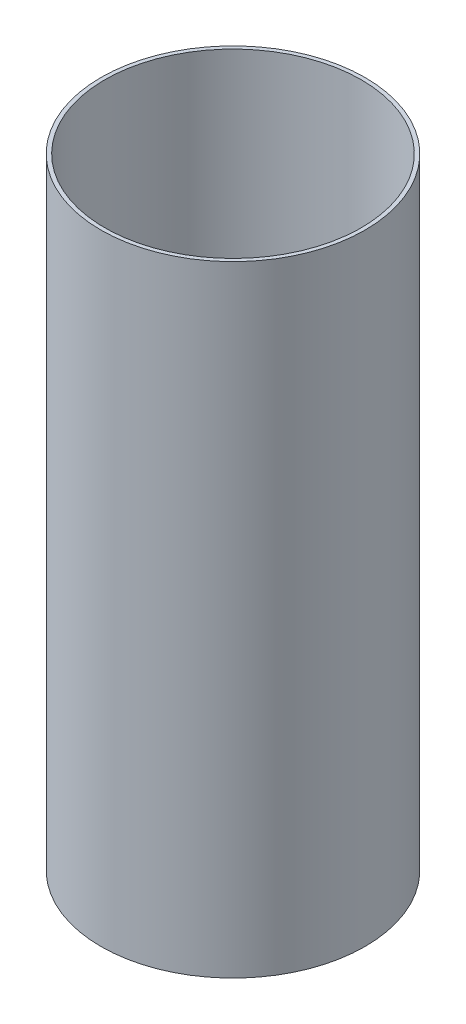
ISO-10303-21;
HEADER;
FILE_DESCRIPTION(('STEP AP214'),'2;1');
FILE_NAME('part.step','',(''),(''),'','','');
FILE_SCHEMA(('AUTOMOTIVE_DESIGN { 1 0 10303 214 1 1 1 1 }'));
ENDSEC;
DATA;
#1=APPLICATION_CONTEXT('core data for automotive mechanical design processes');
#2=APPLICATION_PROTOCOL_DEFINITION('international standard','automotive_design',2000,#1);
#3=PRODUCT_CONTEXT('',#1,'mechanical');
#4=PRODUCT('Part','Part','',(#3));
#5=PRODUCT_RELATED_PRODUCT_CATEGORY('part','',(#4));
#6=PRODUCT_DEFINITION_FORMATION('','',#4);
#7=PRODUCT_DEFINITION_CONTEXT('part definition',#1,'design');
#8=PRODUCT_DEFINITION('design','',#6,#7);
#9=PRODUCT_DEFINITION_SHAPE('','',#8);
#10=(LENGTH_UNIT() NAMED_UNIT(*) SI_UNIT(.MILLI.,.METRE.));
#11=(NAMED_UNIT(*) PLANE_ANGLE_UNIT() SI_UNIT($,.RADIAN.));
#12=(NAMED_UNIT(*) SI_UNIT($,.STERADIAN.) SOLID_ANGLE_UNIT());
#13=UNCERTAINTY_MEASURE_WITH_UNIT(LENGTH_MEASURE(1.E-05),#10,'distance_accuracy_value','');
#14=(GEOMETRIC_REPRESENTATION_CONTEXT(3) GLOBAL_UNCERTAINTY_ASSIGNED_CONTEXT((#13)) GLOBAL_UNIT_ASSIGNED_CONTEXT((#10,
#11,#12)) REPRESENTATION_CONTEXT('',''));
#15=CARTESIAN_POINT('',(0.,0.,0.));
#16=DIRECTION('',(0.,0.,1.));
#17=DIRECTION('',(1.,0.,0.));
#18=AXIS2_PLACEMENT_3D('',#15,#16,#17);
#19=CARTESIAN_POINT('',(0.,152.4,0.));
#20=DIRECTION('',(0.,1.,0.));
#21=DIRECTION('',(0.,0.,1.));
#22=AXIS2_PLACEMENT_3D('',#19,#20,#21);
#23=PLANE('',#22);
#24=CARTESIAN_POINT('',(0.,152.4,0.));
#25=DIRECTION('',(0.,1.,0.));
#26=DIRECTION('',(0.,0.,1.));
#27=AXIS2_PLACEMENT_3D('',#24,#25,#26);
#28=CIRCLE('',#27,32.45);
#29=CARTESIAN_POINT('',(0.,152.4,-32.45));
#30=VERTEX_POINT('',#29);
#31=EDGE_CURVE('E10',#30,#30,#28,.T.);
#32=ORIENTED_EDGE('',*,*,#31,.T.);
#33=EDGE_LOOP('',(#32));
#34=FACE_BOUND('',#33,.T.);
#35=CARTESIAN_POINT('',(0.,152.4,0.));
#36=DIRECTION('',(0.,1.,0.));
#37=DIRECTION('',(0.,0.,1.));
#38=AXIS2_PLACEMENT_3D('',#35,#36,#37);
#39=CIRCLE('',#38,31.5);
#40=CARTESIAN_POINT('',(0.,152.4,-31.5));
#41=VERTEX_POINT('',#40);
#42=EDGE_CURVE('E50',#41,#41,#39,.T.);
#43=ORIENTED_EDGE('',*,*,#42,.F.);
#44=EDGE_LOOP('',(#43));
#45=FACE_BOUND('',#44,.T.);
#46=ADVANCED_FACE('F37',(#34,#45),#23,.T.);
#47=CARTESIAN_POINT('',(0.,0.,0.));
#48=DIRECTION('',(0.,1.,0.));
#49=DIRECTION('',(0.,0.,1.));
#50=AXIS2_PLACEMENT_3D('',#47,#48,#49);
#51=PLANE('',#50);
#52=CARTESIAN_POINT('',(0.,0.,0.));
#53=DIRECTION('',(0.,1.,0.));
#54=DIRECTION('',(0.,0.,1.));
#55=AXIS2_PLACEMENT_3D('',#52,#53,#54);
#56=CIRCLE('',#55,32.45);
#57=CARTESIAN_POINT('',(0.,0.,-32.45));
#58=VERTEX_POINT('',#57);
#59=EDGE_CURVE('E41',#58,#58,#56,.T.);
#60=ORIENTED_EDGE('',*,*,#59,.F.);
#61=EDGE_LOOP('',(#60));
#62=FACE_BOUND('',#61,.T.);
#63=CARTESIAN_POINT('',(0.,0.,0.));
#64=DIRECTION('',(0.,1.,0.));
#65=DIRECTION('',(0.,0.,1.));
#66=AXIS2_PLACEMENT_3D('',#63,#64,#65);
#67=CIRCLE('',#66,31.5);
#68=CARTESIAN_POINT('',(0.,0.,-31.5));
#69=VERTEX_POINT('',#68);
#70=EDGE_CURVE('E52',#69,#69,#67,.T.);
#71=ORIENTED_EDGE('',*,*,#70,.T.);
#72=EDGE_LOOP('',(#71));
#73=FACE_BOUND('',#72,.T.);
#74=ADVANCED_FACE('F64',(#62,#73),#51,.F.);
#75=CARTESIAN_POINT('',(0.,152.4,0.));
#76=DIRECTION('',(0.,-1.,0.));
#77=DIRECTION('',(0.,0.,-1.));
#78=AXIS2_PLACEMENT_3D('',#75,#76,#77);
#79=CYLINDRICAL_SURFACE('',#78,32.45);
#80=CARTESIAN_POINT('',(0.,152.4,-32.45));
#81=CARTESIAN_POINT('',(0.,150.8125,-32.45));
#82=CARTESIAN_POINT('',(0.,149.225,-32.45));
#83=CARTESIAN_POINT('',(0.,146.05,-32.45));
#84=CARTESIAN_POINT('',(0.,144.4625,-32.45));
#85=CARTESIAN_POINT('',(0.,141.2875,-32.45));
#86=CARTESIAN_POINT('',(0.,139.7,-32.45));
#87=CARTESIAN_POINT('',(0.,136.525,-32.45));
#88=CARTESIAN_POINT('',(0.,134.9375,-32.45));
#89=CARTESIAN_POINT('',(0.,131.7625,-32.45));
#90=CARTESIAN_POINT('',(0.,130.175,-32.45));
#91=CARTESIAN_POINT('',(0.,127.,-32.45));
#92=CARTESIAN_POINT('',(0.,125.4125,-32.45));
#93=CARTESIAN_POINT('',(0.,122.2375,-32.45));
#94=CARTESIAN_POINT('',(0.,120.65,-32.45));
#95=CARTESIAN_POINT('',(0.,117.475,-32.45));
#96=CARTESIAN_POINT('',(0.,115.8875,-32.45));
#97=CARTESIAN_POINT('',(0.,112.7125,-32.45));
#98=CARTESIAN_POINT('',(0.,111.125,-32.45));
#99=CARTESIAN_POINT('',(0.,107.95,-32.45));
#100=CARTESIAN_POINT('',(0.,106.3625,-32.45));
#101=CARTESIAN_POINT('',(0.,103.1875,-32.45));
#102=CARTESIAN_POINT('',(0.,101.6,-32.45));
#103=CARTESIAN_POINT('',(0.,98.425,-32.45));
#104=CARTESIAN_POINT('',(0.,96.8375,-32.45));
#105=CARTESIAN_POINT('',(0.,93.6625,-32.45));
#106=CARTESIAN_POINT('',(0.,92.075,-32.45));
#107=CARTESIAN_POINT('',(0.,88.9,-32.45));
#108=CARTESIAN_POINT('',(0.,87.3125,-32.45));
#109=CARTESIAN_POINT('',(0.,84.1375,-32.45));
#110=CARTESIAN_POINT('',(0.,82.55,-32.45));
#111=CARTESIAN_POINT('',(0.,79.375,-32.45));
#112=CARTESIAN_POINT('',(0.,77.7875,-32.45));
#113=CARTESIAN_POINT('',(0.,74.6125,-32.45));
#114=CARTESIAN_POINT('',(0.,73.025,-32.45));
#115=CARTESIAN_POINT('',(0.,69.85,-32.45));
#116=CARTESIAN_POINT('',(0.,68.2625,-32.45));
#117=CARTESIAN_POINT('',(0.,65.0875,-32.45));
#118=CARTESIAN_POINT('',(0.,63.5,-32.45));
#119=CARTESIAN_POINT('',(0.,60.325,-32.45));
#120=CARTESIAN_POINT('',(0.,58.7375,-32.45));
#121=CARTESIAN_POINT('',(0.,55.5625,-32.45));
#122=CARTESIAN_POINT('',(0.,53.975,-32.45));
#123=CARTESIAN_POINT('',(0.,50.8,-32.45));
#124=CARTESIAN_POINT('',(0.,49.2125,-32.45));
#125=CARTESIAN_POINT('',(0.,46.0375,-32.45));
#126=CARTESIAN_POINT('',(0.,44.45,-32.45));
#127=CARTESIAN_POINT('',(0.,41.275,-32.45));
#128=CARTESIAN_POINT('',(0.,39.6875,-32.45));
#129=CARTESIAN_POINT('',(0.,36.5125,-32.45));
#130=CARTESIAN_POINT('',(0.,34.925,-32.45));
#131=CARTESIAN_POINT('',(0.,31.75,-32.45));
#132=CARTESIAN_POINT('',(0.,30.1625,-32.45));
#133=CARTESIAN_POINT('',(0.,26.9875,-32.45));
#134=CARTESIAN_POINT('',(0.,25.4,-32.45));
#135=CARTESIAN_POINT('',(0.,22.225,-32.45));
#136=CARTESIAN_POINT('',(0.,20.6375,-32.45));
#137=CARTESIAN_POINT('',(0.,17.4625,-32.45));
#138=CARTESIAN_POINT('',(0.,15.875,-32.45));
#139=CARTESIAN_POINT('',(0.,12.7,-32.45));
#140=CARTESIAN_POINT('',(0.,11.1125,-32.45));
#141=CARTESIAN_POINT('',(0.,7.93750000000001,-32.45));
#142=CARTESIAN_POINT('',(0.,6.35,-32.45));
#143=CARTESIAN_POINT('',(0.,3.175,-32.45));
#144=CARTESIAN_POINT('',(0.,1.5875,-32.45));
#145=CARTESIAN_POINT('',(0.,0.,-32.45));
#146=B_SPLINE_CURVE_WITH_KNOTS('',3,(#80,#81,#82,#83,#84,#85,#86,#87,#88,#89,#90,#91,#92,#93,
#94,#95,#96,#97,#98,#99,#100,#101,#102,#103,#104,#105,#106,#107,#108,#109,#110,#111,#112,#113,
#114,#115,#116,#117,#118,#119,#120,#121,#122,#123,#124,#125,#126,#127,#128,#129,#130,#131,#132,
#133,#134,#135,#136,#137,#138,#139,#140,#141,#142,#143,#144,#145),.UNSPECIFIED.,.F.,.F.,(4,2,2,
2,2,2,2,2,2,2,2,2,2,2,2,2,2,2,2,2,2,2,2,2,2,2,2,2,2,2,2,2,4),(0.,4.7625,9.52500000000001,
14.2875,19.05,23.8125,28.575,33.3375,38.1,42.8625,47.625,52.3875,57.15,61.9125,66.675,71.4375,
76.2,80.9625,85.725,90.4875,95.25,100.0125,104.775,109.5375,114.3,119.0625,123.825,128.5875,
133.35,138.1125,142.875,147.6375,152.4),.UNSPECIFIED.);
#147=EDGE_CURVE('BSEAM39',#30,#58,#146,.T.);
#148=ORIENTED_EDGE('',*,*,#31,.F.);
#149=ORIENTED_EDGE('',*,*,#59,.T.);
#150=ORIENTED_EDGE('',*,*,#147,.T.);
#151=ORIENTED_EDGE('',*,*,#147,.F.);
#152=EDGE_LOOP('',(#148,#150,#149,#151));
#153=FACE_BOUND('',#152,.T.);
#154=ADVANCED_FACE('F39',(#153),#79,.T.);
#155=CARTESIAN_POINT('',(0.,152.4,0.));
#156=DIRECTION('',(0.,-1.,0.));
#157=DIRECTION('',(0.,0.,-1.));
#158=AXIS2_PLACEMENT_3D('',#155,#156,#157);
#159=CYLINDRICAL_SURFACE('',#158,31.5);
#160=CARTESIAN_POINT('',(0.,152.4,-31.5));
#161=CARTESIAN_POINT('',(0.,150.8125,-31.5));
#162=CARTESIAN_POINT('',(0.,149.225,-31.5));
#163=CARTESIAN_POINT('',(0.,146.05,-31.5));
#164=CARTESIAN_POINT('',(0.,144.4625,-31.5));
#165=CARTESIAN_POINT('',(0.,141.2875,-31.5));
#166=CARTESIAN_POINT('',(0.,139.7,-31.5));
#167=CARTESIAN_POINT('',(0.,136.525,-31.5));
#168=CARTESIAN_POINT('',(0.,134.9375,-31.5));
#169=CARTESIAN_POINT('',(0.,131.7625,-31.5));
#170=CARTESIAN_POINT('',(0.,130.175,-31.5));
#171=CARTESIAN_POINT('',(0.,127.,-31.5));
#172=CARTESIAN_POINT('',(0.,125.4125,-31.5));
#173=CARTESIAN_POINT('',(0.,122.2375,-31.5));
#174=CARTESIAN_POINT('',(0.,120.65,-31.5));
#175=CARTESIAN_POINT('',(0.,117.475,-31.5));
#176=CARTESIAN_POINT('',(0.,115.8875,-31.5));
#177=CARTESIAN_POINT('',(0.,112.7125,-31.5));
#178=CARTESIAN_POINT('',(0.,111.125,-31.5));
#179=CARTESIAN_POINT('',(0.,107.95,-31.5));
#180=CARTESIAN_POINT('',(0.,106.3625,-31.5));
#181=CARTESIAN_POINT('',(0.,103.1875,-31.5));
#182=CARTESIAN_POINT('',(0.,101.6,-31.5));
#183=CARTESIAN_POINT('',(0.,98.425,-31.5));
#184=CARTESIAN_POINT('',(0.,96.8375,-31.5));
#185=CARTESIAN_POINT('',(0.,93.6625,-31.5));
#186=CARTESIAN_POINT('',(0.,92.075,-31.5));
#187=CARTESIAN_POINT('',(0.,88.9,-31.5));
#188=CARTESIAN_POINT('',(0.,87.3125,-31.5));
#189=CARTESIAN_POINT('',(0.,84.1375,-31.5));
#190=CARTESIAN_POINT('',(0.,82.55,-31.5));
#191=CARTESIAN_POINT('',(0.,79.375,-31.5));
#192=CARTESIAN_POINT('',(0.,77.7875,-31.5));
#193=CARTESIAN_POINT('',(0.,74.6125,-31.5));
#194=CARTESIAN_POINT('',(0.,73.025,-31.5));
#195=CARTESIAN_POINT('',(0.,69.85,-31.5));
#196=CARTESIAN_POINT('',(0.,68.2625,-31.5));
#197=CARTESIAN_POINT('',(0.,65.0875,-31.5));
#198=CARTESIAN_POINT('',(0.,63.5,-31.5));
#199=CARTESIAN_POINT('',(0.,60.325,-31.5));
#200=CARTESIAN_POINT('',(0.,58.7375,-31.5));
#201=CARTESIAN_POINT('',(0.,55.5625,-31.5));
#202=CARTESIAN_POINT('',(0.,53.975,-31.5));
#203=CARTESIAN_POINT('',(0.,50.8,-31.5));
#204=CARTESIAN_POINT('',(0.,49.2125,-31.5));
#205=CARTESIAN_POINT('',(0.,46.0375,-31.5));
#206=CARTESIAN_POINT('',(0.,44.45,-31.5));
#207=CARTESIAN_POINT('',(0.,41.275,-31.5));
#208=CARTESIAN_POINT('',(0.,39.6875,-31.5));
#209=CARTESIAN_POINT('',(0.,36.5125,-31.5));
#210=CARTESIAN_POINT('',(0.,34.925,-31.5));
#211=CARTESIAN_POINT('',(0.,31.75,-31.5));
#212=CARTESIAN_POINT('',(0.,30.1625,-31.5));
#213=CARTESIAN_POINT('',(0.,26.9875,-31.5));
#214=CARTESIAN_POINT('',(0.,25.4,-31.5));
#215=CARTESIAN_POINT('',(0.,22.225,-31.5));
#216=CARTESIAN_POINT('',(0.,20.6375,-31.5));
#217=CARTESIAN_POINT('',(0.,17.4625,-31.5));
#218=CARTESIAN_POINT('',(0.,15.875,-31.5));
#219=CARTESIAN_POINT('',(0.,12.7,-31.5));
#220=CARTESIAN_POINT('',(0.,11.1125,-31.5));
#221=CARTESIAN_POINT('',(0.,7.93750000000001,-31.5));
#222=CARTESIAN_POINT('',(0.,6.35,-31.5));
#223=CARTESIAN_POINT('',(0.,3.175,-31.5));
#224=CARTESIAN_POINT('',(0.,1.5875,-31.5));
#225=CARTESIAN_POINT('',(0.,0.,-31.5));
#226=B_SPLINE_CURVE_WITH_KNOTS('',3,(#160,#161,#162,#163,#164,#165,#166,#167,#168,#169,#170,
#171,#172,#173,#174,#175,#176,#177,#178,#179,#180,#181,#182,#183,#184,#185,#186,#187,#188,#189,
#190,#191,#192,#193,#194,#195,#196,#197,#198,#199,#200,#201,#202,#203,#204,#205,#206,#207,#208,
#209,#210,#211,#212,#213,#214,#215,#216,#217,#218,#219,#220,#221,#222,#223,#224,#225),
.UNSPECIFIED.,.F.,.F.,(4,2,2,2,2,2,2,2,2,2,2,2,2,2,2,2,2,2,2,2,2,2,2,2,2,2,2,2,2,2,2,2,4),(0.,
4.7625,9.52500000000001,14.2875,19.05,23.8125,28.575,33.3375,38.1,42.8625,47.625,52.3875,57.15,
61.9125,66.675,71.4375,76.2,80.9625,85.725,90.4875,95.25,100.0125,104.775,109.5375,114.3,
119.0625,123.825,128.5875,133.35,138.1125,142.875,147.6375,152.4),.UNSPECIFIED.);
#227=EDGE_CURVE('BSEAM60',#41,#69,#226,.T.);
#228=ORIENTED_EDGE('',*,*,#42,.T.);
#229=ORIENTED_EDGE('',*,*,#70,.F.);
#230=ORIENTED_EDGE('',*,*,#227,.T.);
#231=ORIENTED_EDGE('',*,*,#227,.F.);
#232=EDGE_LOOP('',(#228,#230,#229,#231));
#233=FACE_BOUND('',#232,.T.);
#234=ADVANCED_FACE('F60',(#233),#159,.F.);
#235=CLOSED_SHELL('',(#46,#74,#154,#234));
#236=MANIFOLD_SOLID_BREP('B2',#235);
#237=ADVANCED_BREP_SHAPE_REPRESENTATION('',(#18,#236),#14);
#238=SHAPE_DEFINITION_REPRESENTATION(#9,#237);
ENDSEC;
END-ISO-10303-21;
